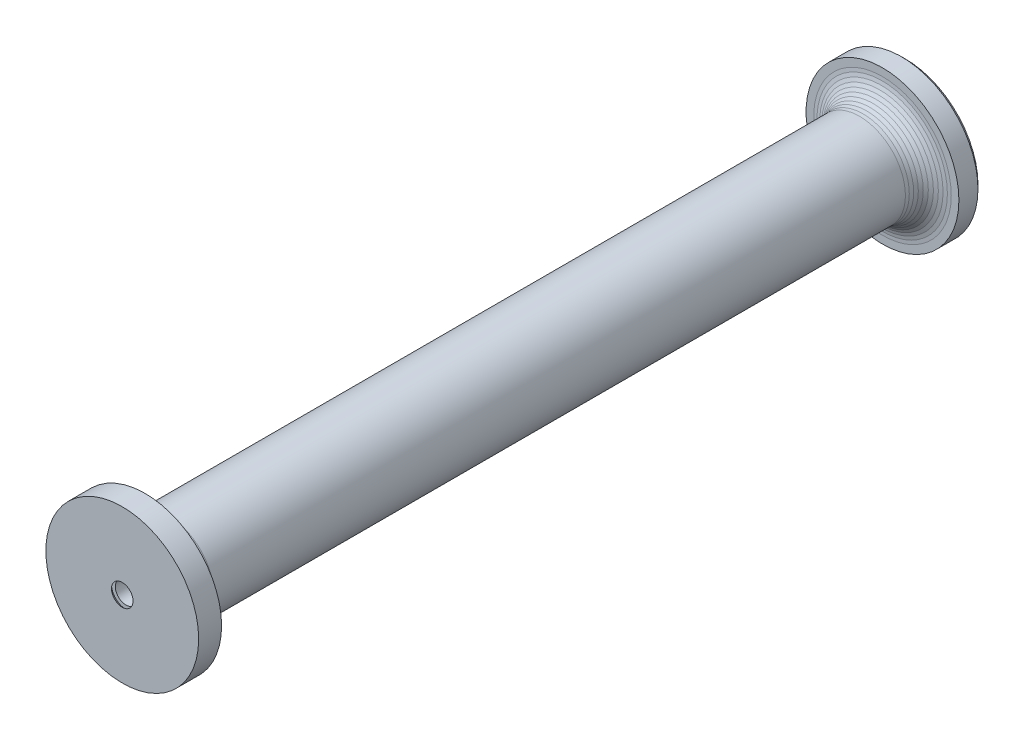
ISO-10303-21;
HEADER;
FILE_DESCRIPTION(('STEP AP214'),'2;1');
FILE_NAME('part.step','',(''),(''),'','','');
FILE_SCHEMA(('AUTOMOTIVE_DESIGN { 1 0 10303 214 1 1 1 1 }'));
ENDSEC;
DATA;
#1=APPLICATION_CONTEXT('core data for automotive mechanical design processes');
#2=APPLICATION_PROTOCOL_DEFINITION('international standard','automotive_design',2000,#1);
#3=PRODUCT_CONTEXT('',#1,'mechanical');
#4=PRODUCT('Part','Part','',(#3));
#5=PRODUCT_RELATED_PRODUCT_CATEGORY('part','',(#4));
#6=PRODUCT_DEFINITION_FORMATION('','',#4);
#7=PRODUCT_DEFINITION_CONTEXT('part definition',#1,'design');
#8=PRODUCT_DEFINITION('design','',#6,#7);
#9=PRODUCT_DEFINITION_SHAPE('','',#8);
#10=(LENGTH_UNIT() NAMED_UNIT(*) SI_UNIT(.MILLI.,.METRE.));
#11=(NAMED_UNIT(*) PLANE_ANGLE_UNIT() SI_UNIT($,.RADIAN.));
#12=(NAMED_UNIT(*) SI_UNIT($,.STERADIAN.) SOLID_ANGLE_UNIT());
#13=UNCERTAINTY_MEASURE_WITH_UNIT(LENGTH_MEASURE(1.E-05),#10,'distance_accuracy_value','');
#14=(GEOMETRIC_REPRESENTATION_CONTEXT(3) GLOBAL_UNCERTAINTY_ASSIGNED_CONTEXT((#13)) GLOBAL_UNIT_ASSIGNED_CONTEXT((#10,
#11,#12)) REPRESENTATION_CONTEXT('',''));
#15=CARTESIAN_POINT('',(0.,0.,0.));
#16=DIRECTION('',(0.,0.,1.));
#17=DIRECTION('',(1.,0.,0.));
#18=AXIS2_PLACEMENT_3D('',#15,#16,#17);
#19=CARTESIAN_POINT('',(0.,0.,12.01));
#20=DIRECTION('',(0.,0.,1.));
#21=DIRECTION('',(1.,0.,0.));
#22=AXIS2_PLACEMENT_3D('',#19,#20,#21);
#23=PLANE('',#22);
#24=CARTESIAN_POINT('',(0.,0.,12.01));
#25=DIRECTION('',(0.,0.,1.));
#26=DIRECTION('',(1.,0.,0.));
#27=AXIS2_PLACEMENT_3D('',#24,#25,#26);
#28=CIRCLE('',#27,1.4);
#29=CARTESIAN_POINT('',(1.4,0.,12.01));
#30=VERTEX_POINT('',#29);
#31=EDGE_CURVE('E9',#30,#30,#28,.T.);
#32=ORIENTED_EDGE('',*,*,#31,.F.);
#33=EDGE_LOOP('',(#32));
#34=FACE_BOUND('',#33,.T.);
#35=ADVANCED_FACE('F14',(#34),#23,.F.);
#36=CARTESIAN_POINT('',(0.,0.,-0.01));
#37=DIRECTION('',(0.,0.,1.));
#38=DIRECTION('',(1.,0.,0.));
#39=AXIS2_PLACEMENT_3D('',#36,#37,#38);
#40=CYLINDRICAL_SURFACE('',#39,1.4);
#41=CARTESIAN_POINT('',(0.,0.,0.49));
#42=DIRECTION('',(0.,0.,1.));
#43=DIRECTION('',(1.,0.,0.));
#44=AXIS2_PLACEMENT_3D('',#41,#42,#43);
#45=CIRCLE('',#44,1.4);
#46=CARTESIAN_POINT('',(1.4,0.,0.49));
#47=VERTEX_POINT('',#46);
#48=EDGE_CURVE('E262',#47,#47,#45,.T.);
#49=ORIENTED_EDGE('',*,*,#48,.F.);
#50=DIRECTION('',(0.,0.,1.));
#51=VECTOR('',#50,1.);
#52=CARTESIAN_POINT('',(1.4,0.,-0.01));
#53=LINE('',#52,#51);
#54=EDGE_CURVE('E25',#47,#30,#53,.T.);
#55=ORIENTED_EDGE('',*,*,#54,.T.);
#56=ORIENTED_EDGE('',*,*,#31,.T.);
#57=ORIENTED_EDGE('',*,*,#54,.F.);
#58=EDGE_LOOP('',(#49,#55,#56,#57));
#59=FACE_BOUND('',#58,.T.);
#60=ADVANCED_FACE('F397',(#59),#40,.F.);
#61=CARTESIAN_POINT('',(0.,0.,90.49));
#62=DIRECTION('',(0.,0.,1.));
#63=DIRECTION('',(1.,0.,0.));
#64=AXIS2_PLACEMENT_3D('',#61,#62,#63);
#65=PLANE('',#64);
#66=CARTESIAN_POINT('',(0.,0.,90.49));
#67=DIRECTION('',(0.,0.,1.));
#68=DIRECTION('',(1.,0.,0.));
#69=AXIS2_PLACEMENT_3D('',#66,#67,#68);
#70=CIRCLE('',#69,1.4);
#71=CARTESIAN_POINT('',(1.4,0.,90.49));
#72=VERTEX_POINT('',#71);
#73=EDGE_CURVE('E259',#72,#72,#70,.T.);
#74=ORIENTED_EDGE('',*,*,#73,.T.);
#75=EDGE_LOOP('',(#74));
#76=FACE_BOUND('',#75,.T.);
#77=ADVANCED_FACE('F403',(#76),#65,.T.);
#78=CARTESIAN_POINT('',(0.,0.,0.49));
#79=DIRECTION('',(0.,0.,1.));
#80=DIRECTION('',(1.,0.,0.));
#81=AXIS2_PLACEMENT_3D('',#78,#79,#80);
#82=PLANE('',#81);
#83=ORIENTED_EDGE('',*,*,#48,.T.);
#84=EDGE_LOOP('',(#83));
#85=FACE_BOUND('',#84,.T.);
#86=CARTESIAN_POINT('',(0.,0.,0.49));
#87=DIRECTION('',(0.,0.,1.));
#88=DIRECTION('',(1.,0.,0.));
#89=AXIS2_PLACEMENT_3D('',#86,#87,#88);
#90=CIRCLE('',#89,1.9);
#91=CARTESIAN_POINT('',(1.9,0.,0.49));
#92=VERTEX_POINT('',#91);
#93=EDGE_CURVE('E275',#92,#92,#90,.T.);
#94=ORIENTED_EDGE('',*,*,#93,.F.);
#95=EDGE_LOOP('',(#94));
#96=FACE_BOUND('',#95,.T.);
#97=ADVANCED_FACE('F411',(#85,#96),#82,.F.);
#98=CARTESIAN_POINT('',(0.,0.,90.49));
#99=DIRECTION('',(0.,0.,1.));
#100=DIRECTION('',(1.,0.,0.));
#101=AXIS2_PLACEMENT_3D('',#98,#99,#100);
#102=CYLINDRICAL_SURFACE('',#101,1.4);
#103=DIRECTION('',(0.,0.,1.));
#104=VECTOR('',#103,1.);
#105=CARTESIAN_POINT('',(1.4,0.,90.49));
#106=LINE('',#105,#104);
#107=CARTESIAN_POINT('',(1.4,0.,102.01));
#108=VERTEX_POINT('',#107);
#109=EDGE_CURVE('E263',#72,#108,#106,.T.);
#110=ORIENTED_EDGE('',*,*,#109,.F.);
#111=ORIENTED_EDGE('',*,*,#73,.F.);
#112=ORIENTED_EDGE('',*,*,#109,.T.);
#113=CARTESIAN_POINT('',(0.,0.,102.01));
#114=DIRECTION('',(0.,0.,1.));
#115=DIRECTION('',(1.,0.,0.));
#116=AXIS2_PLACEMENT_3D('',#113,#114,#115);
#117=CIRCLE('',#116,1.4);
#118=EDGE_CURVE('E772',#108,#108,#117,.T.);
#119=ORIENTED_EDGE('',*,*,#118,.T.);
#120=EDGE_LOOP('',(#110,#111,#112,#119));
#121=FACE_BOUND('',#120,.T.);
#122=ADVANCED_FACE('F390',(#121),#102,.F.);
#123=CARTESIAN_POINT('',(0.,0.,-0.01));
#124=DIRECTION('',(0.,0.,1.));
#125=DIRECTION('',(1.,0.,0.));
#126=AXIS2_PLACEMENT_3D('',#123,#124,#125);
#127=CONICAL_SURFACE('',#126,1.4,0.785398163397);
#128=CARTESIAN_POINT('',(0.,0.,0.));
#129=DIRECTION('',(0.,0.,1.));
#130=DIRECTION('',(1.,0.,0.));
#131=AXIS2_PLACEMENT_3D('',#128,#129,#130);
#132=CIRCLE('',#131,1.41);
#133=CARTESIAN_POINT('',(1.41,0.,0.));
#134=VERTEX_POINT('',#133);
#135=EDGE_CURVE('E251',#134,#134,#132,.T.);
#136=ORIENTED_EDGE('',*,*,#135,.F.);
#137=DIRECTION('',(0.707106781186548,0.,0.707106781186548));
#138=VECTOR('',#137,1.);
#139=CARTESIAN_POINT('',(1.4,0.,-0.01));
#140=LINE('',#139,#138);
#141=EDGE_CURVE('E353',#134,#92,#140,.T.);
#142=ORIENTED_EDGE('',*,*,#141,.T.);
#143=ORIENTED_EDGE('',*,*,#93,.T.);
#144=ORIENTED_EDGE('',*,*,#141,.F.);
#145=EDGE_LOOP('',(#136,#142,#143,#144));
#146=FACE_BOUND('',#145,.T.);
#147=ADVANCED_FACE('F380',(#146),#127,.F.);
#148=CARTESIAN_POINT('',(0.,0.,102.01));
#149=DIRECTION('',(0.,0.,1.));
#150=DIRECTION('',(1.,0.,0.));
#151=AXIS2_PLACEMENT_3D('',#148,#149,#150);
#152=PLANE('',#151);
#153=ORIENTED_EDGE('',*,*,#118,.F.);
#154=EDGE_LOOP('',(#153));
#155=FACE_BOUND('',#154,.T.);
#156=CARTESIAN_POINT('',(0.,0.,102.01));
#157=DIRECTION('',(0.,0.,1.));
#158=DIRECTION('',(1.,0.,0.));
#159=AXIS2_PLACEMENT_3D('',#156,#157,#158);
#160=CIRCLE('',#159,1.9);
#161=CARTESIAN_POINT('',(1.9,0.,102.01));
#162=VERTEX_POINT('',#161);
#163=EDGE_CURVE('E249',#162,#162,#160,.T.);
#164=ORIENTED_EDGE('',*,*,#163,.T.);
#165=EDGE_LOOP('',(#164));
#166=FACE_BOUND('',#165,.T.);
#167=ADVANCED_FACE('F377',(#155,#166),#152,.T.);
#168=CARTESIAN_POINT('',(0.,0.,0.));
#169=DIRECTION('',(0.,0.,1.));
#170=DIRECTION('',(1.,0.,0.));
#171=AXIS2_PLACEMENT_3D('',#168,#169,#170);
#172=PLANE('',#171);
#173=ORIENTED_EDGE('',*,*,#135,.T.);
#174=EDGE_LOOP('',(#173));
#175=FACE_BOUND('',#174,.T.);
#176=CARTESIAN_POINT('',(0.,0.,0.));
#177=DIRECTION('',(0.,0.,1.));
#178=DIRECTION('',(1.,0.,0.));
#179=AXIS2_PLACEMENT_3D('',#176,#177,#178);
#180=CIRCLE('',#179,9.5);
#181=CARTESIAN_POINT('',(9.5,0.,0.));
#182=VERTEX_POINT('',#181);
#183=EDGE_CURVE('E349',#182,#182,#180,.T.);
#184=ORIENTED_EDGE('',*,*,#183,.F.);
#185=EDGE_LOOP('',(#184));
#186=FACE_BOUND('',#185,.T.);
#187=ADVANCED_FACE('F379',(#175,#186),#172,.F.);
#188=CARTESIAN_POINT('',(0.,0.,102.01));
#189=DIRECTION('',(0.,0.,-1.));
#190=DIRECTION('',(1.,0.,0.));
#191=AXIS2_PLACEMENT_3D('',#188,#189,#190);
#192=CONICAL_SURFACE('',#191,1.9,0.785398163397);
#193=DIRECTION('',(-0.707106781186548,0.,0.707106781186548));
#194=VECTOR('',#193,1.);
#195=CARTESIAN_POINT('',(1.9,0.,102.01));
#196=LINE('',#195,#194);
#197=CARTESIAN_POINT('',(1.41,0.,102.5));
#198=VERTEX_POINT('',#197);
#199=EDGE_CURVE('E252',#162,#198,#196,.T.);
#200=ORIENTED_EDGE('',*,*,#199,.F.);
#201=ORIENTED_EDGE('',*,*,#163,.F.);
#202=ORIENTED_EDGE('',*,*,#199,.T.);
#203=CARTESIAN_POINT('',(0.,0.,102.5));
#204=DIRECTION('',(0.,0.,1.));
#205=DIRECTION('',(1.,0.,0.));
#206=AXIS2_PLACEMENT_3D('',#203,#204,#205);
#207=CIRCLE('',#206,1.41);
#208=EDGE_CURVE('E311',#198,#198,#207,.T.);
#209=ORIENTED_EDGE('',*,*,#208,.T.);
#210=EDGE_LOOP('',(#200,#201,#202,#209));
#211=FACE_BOUND('',#210,.T.);
#212=ADVANCED_FACE('F374',(#211),#192,.F.);
#213=CARTESIAN_POINT('',(0.,0.,0.));
#214=DIRECTION('',(0.,0.,1.));
#215=DIRECTION('',(1.,0.,0.));
#216=AXIS2_PLACEMENT_3D('',#213,#214,#215);
#217=CONICAL_SURFACE('',#216,9.5,0.775497496809);
#218=CARTESIAN_POINT('',(0.,0.,0.505));
#219=DIRECTION('',(0.,0.,1.));
#220=DIRECTION('',(1.,0.,0.));
#221=AXIS2_PLACEMENT_3D('',#218,#219,#220);
#222=CIRCLE('',#221,9.995098039216);
#223=CARTESIAN_POINT('',(9.995098039216,0.,0.505));
#224=VERTEX_POINT('',#223);
#225=EDGE_CURVE('E307',#224,#224,#222,.T.);
#226=ORIENTED_EDGE('',*,*,#225,.F.);
#227=DIRECTION('',(0.700071410925818,0.,0.714072839144814));
#228=VECTOR('',#227,1.);
#229=CARTESIAN_POINT('',(9.5,0.,0.));
#230=LINE('',#229,#228);
#231=EDGE_CURVE('E330',#182,#224,#230,.T.);
#232=ORIENTED_EDGE('',*,*,#231,.F.);
#233=ORIENTED_EDGE('',*,*,#183,.T.);
#234=ORIENTED_EDGE('',*,*,#231,.T.);
#235=EDGE_LOOP('',(#226,#232,#233,#234));
#236=FACE_BOUND('',#235,.T.);
#237=ADVANCED_FACE('F417',(#236),#217,.T.);
#238=CARTESIAN_POINT('',(0.,0.,102.5));
#239=DIRECTION('',(0.,0.,1.));
#240=DIRECTION('',(1.,0.,0.));
#241=AXIS2_PLACEMENT_3D('',#238,#239,#240);
#242=PLANE('',#241);
#243=ORIENTED_EDGE('',*,*,#208,.F.);
#244=EDGE_LOOP('',(#243));
#245=FACE_BOUND('',#244,.T.);
#246=CARTESIAN_POINT('',(0.,0.,102.5));
#247=DIRECTION('',(0.,0.,1.));
#248=DIRECTION('',(1.,0.,0.));
#249=AXIS2_PLACEMENT_3D('',#246,#247,#248);
#250=CIRCLE('',#249,10.);
#251=CARTESIAN_POINT('',(10.,0.,102.5));
#252=VERTEX_POINT('',#251);
#253=EDGE_CURVE('E334',#252,#252,#250,.T.);
#254=ORIENTED_EDGE('',*,*,#253,.T.);
#255=EDGE_LOOP('',(#254));
#256=FACE_BOUND('',#255,.T.);
#257=ADVANCED_FACE('F420',(#245,#256),#242,.T.);
#258=CARTESIAN_POINT('',(0.,0.,0.505));
#259=DIRECTION('',(0.,0.,1.));
#260=DIRECTION('',(1.,0.,0.));
#261=AXIS2_PLACEMENT_3D('',#258,#259,#260);
#262=PLANE('',#261);
#263=ORIENTED_EDGE('',*,*,#225,.T.);
#264=EDGE_LOOP('',(#263));
#265=FACE_BOUND('',#264,.T.);
#266=CARTESIAN_POINT('',(0.,0.,0.505));
#267=DIRECTION('',(0.,0.,1.));
#268=DIRECTION('',(1.,0.,0.));
#269=AXIS2_PLACEMENT_3D('',#266,#267,#268);
#270=CIRCLE('',#269,10.);
#271=CARTESIAN_POINT('',(10.,0.,0.505));
#272=VERTEX_POINT('',#271);
#273=EDGE_CURVE('E303',#272,#272,#270,.T.);
#274=ORIENTED_EDGE('',*,*,#273,.F.);
#275=EDGE_LOOP('',(#274));
#276=FACE_BOUND('',#275,.T.);
#277=ADVANCED_FACE('F467',(#265,#276),#262,.F.);
#278=CARTESIAN_POINT('',(0.,0.,99.5));
#279=DIRECTION('',(0.,0.,1.));
#280=DIRECTION('',(1.,0.,0.));
#281=AXIS2_PLACEMENT_3D('',#278,#279,#280);
#282=CYLINDRICAL_SURFACE('',#281,10.);
#283=ORIENTED_EDGE('',*,*,#253,.F.);
#284=DIRECTION('',(0.,0.,1.));
#285=VECTOR('',#284,1.);
#286=CARTESIAN_POINT('',(10.,0.,99.5));
#287=LINE('',#286,#285);
#288=CARTESIAN_POINT('',(10.,0.,99.5));
#289=VERTEX_POINT('',#288);
#290=EDGE_CURVE('E312',#289,#252,#287,.T.);
#291=ORIENTED_EDGE('',*,*,#290,.F.);
#292=CARTESIAN_POINT('',(0.,0.,99.5));
#293=DIRECTION('',(0.,0.,1.));
#294=DIRECTION('',(1.,0.,0.));
#295=AXIS2_PLACEMENT_3D('',#292,#293,#294);
#296=CIRCLE('',#295,10.);
#297=EDGE_CURVE('E273',#289,#289,#296,.T.);
#298=ORIENTED_EDGE('',*,*,#297,.T.);
#299=ORIENTED_EDGE('',*,*,#290,.T.);
#300=EDGE_LOOP('',(#283,#291,#298,#299));
#301=FACE_BOUND('',#300,.T.);
#302=ADVANCED_FACE('F463',(#301),#282,.T.);
#303=CARTESIAN_POINT('',(0.,0.,0.));
#304=DIRECTION('',(0.,0.,1.));
#305=DIRECTION('',(1.,0.,0.));
#306=AXIS2_PLACEMENT_3D('',#303,#304,#305);
#307=CYLINDRICAL_SURFACE('',#306,10.);
#308=DIRECTION('',(0.,0.,1.));
#309=VECTOR('',#308,1.);
#310=CARTESIAN_POINT('',(10.,0.,0.));
#311=LINE('',#310,#309);
#312=CARTESIAN_POINT('',(10.,0.,3.));
#313=VERTEX_POINT('',#312);
#314=EDGE_CURVE('E300',#272,#313,#311,.T.);
#315=ORIENTED_EDGE('',*,*,#314,.T.);
#316=CARTESIAN_POINT('',(0.,0.,3.));
#317=DIRECTION('',(0.,0.,1.));
#318=DIRECTION('',(1.,0.,0.));
#319=AXIS2_PLACEMENT_3D('',#316,#317,#318);
#320=CIRCLE('',#319,10.);
#321=EDGE_CURVE('E269',#313,#313,#320,.T.);
#322=ORIENTED_EDGE('',*,*,#321,.F.);
#323=ORIENTED_EDGE('',*,*,#314,.F.);
#324=ORIENTED_EDGE('',*,*,#273,.T.);
#325=EDGE_LOOP('',(#315,#322,#323,#324));
#326=FACE_BOUND('',#325,.T.);
#327=ADVANCED_FACE('F466',(#326),#307,.T.);
#328=CARTESIAN_POINT('',(0.,0.,99.5));
#329=DIRECTION('',(0.,0.,1.));
#330=DIRECTION('',(1.,0.,0.));
#331=AXIS2_PLACEMENT_3D('',#328,#329,#330);
#332=PLANE('',#331);
#333=CARTESIAN_POINT('',(0.,0.,99.5));
#334=DIRECTION('',(0.,0.,-1.));
#335=DIRECTION('',(1.,0.,0.));
#336=AXIS2_PLACEMENT_3D('',#333,#334,#335);
#337=CIRCLE('',#336,9.);
#338=CARTESIAN_POINT('',(9.,0.,99.5));
#339=VERTEX_POINT('',#338);
#340=EDGE_CURVE('E306',#339,#339,#337,.T.);
#341=ORIENTED_EDGE('',*,*,#340,.F.);
#342=EDGE_LOOP('',(#341));
#343=FACE_BOUND('',#342,.T.);
#344=ORIENTED_EDGE('',*,*,#297,.F.);
#345=EDGE_LOOP('',(#344));
#346=FACE_BOUND('',#345,.T.);
#347=ADVANCED_FACE('F471',(#343,#346),#332,.F.);
#348=CARTESIAN_POINT('',(0.,0.,3.));
#349=DIRECTION('',(0.,0.,1.));
#350=DIRECTION('',(1.,0.,0.));
#351=AXIS2_PLACEMENT_3D('',#348,#349,#350);
#352=PLANE('',#351);
#353=CARTESIAN_POINT('',(0.,0.,3.));
#354=DIRECTION('',(0.,0.,1.));
#355=DIRECTION('',(1.,0.,0.));
#356=AXIS2_PLACEMENT_3D('',#353,#354,#355);
#357=CIRCLE('',#356,9.);
#358=CARTESIAN_POINT('',(9.,0.,3.));
#359=VERTEX_POINT('',#358);
#360=EDGE_CURVE('E284',#359,#359,#357,.T.);
#361=ORIENTED_EDGE('',*,*,#360,.F.);
#362=EDGE_LOOP('',(#361));
#363=FACE_BOUND('',#362,.T.);
#364=ORIENTED_EDGE('',*,*,#321,.T.);
#365=EDGE_LOOP('',(#364));
#366=FACE_BOUND('',#365,.T.);
#367=ADVANCED_FACE('F483',(#363,#366),#352,.T.);
#368=CARTESIAN_POINT('',(0.,0.,99.5));
#369=DIRECTION('',(0.,0.,1.));
#370=DIRECTION('',(1.,0.,0.));
#371=AXIS2_PLACEMENT_3D('',#368,#369,#370);
#372=CONICAL_SURFACE('',#371,9.,1.492256510455);
#373=ORIENTED_EDGE('',*,*,#340,.T.);
#374=DIRECTION('',(-0.996917333733127,0.,-0.07845909572786));
#375=VECTOR('',#374,1.);
#376=CARTESIAN_POINT('',(9.,0.,99.5));
#377=LINE('',#376,#375);
#378=CARTESIAN_POINT('',(8.530696604879,0.,99.463065021785));
#379=VERTEX_POINT('',#378);
#380=EDGE_CURVE('E163',#339,#379,#377,.T.);
#381=ORIENTED_EDGE('',*,*,#380,.T.);
#382=CARTESIAN_POINT('',(0.,0.,99.463065021785));
#383=DIRECTION('',(0.,0.,-1.));
#384=DIRECTION('',(1.,0.,0.));
#385=AXIS2_PLACEMENT_3D('',#382,#383,#384);
#386=CIRCLE('',#385,8.530696604879);
#387=EDGE_CURVE('E257',#379,#379,#386,.T.);
#388=ORIENTED_EDGE('',*,*,#387,.F.);
#389=ORIENTED_EDGE('',*,*,#380,.F.);
#390=EDGE_LOOP('',(#373,#381,#388,#389));
#391=FACE_BOUND('',#390,.T.);
#392=ADVANCED_FACE('F449',(#391),#372,.T.);
#393=CARTESIAN_POINT('',(0.,0.,3.));
#394=DIRECTION('',(0.,0.,-1.));
#395=DIRECTION('',(1.,0.,0.));
#396=AXIS2_PLACEMENT_3D('',#393,#394,#395);
#397=CONICAL_SURFACE('',#396,9.,1.492256510455);
#398=ORIENTED_EDGE('',*,*,#360,.T.);
#399=DIRECTION('',(-0.996917333733127,0.,0.07845909572786));
#400=VECTOR('',#399,1.);
#401=CARTESIAN_POINT('',(9.,0.,3.));
#402=LINE('',#401,#400);
#403=CARTESIAN_POINT('',(8.530696604879,0.,3.036934978215));
#404=VERTEX_POINT('',#403);
#405=EDGE_CURVE('E173',#359,#404,#402,.T.);
#406=ORIENTED_EDGE('',*,*,#405,.T.);
#407=CARTESIAN_POINT('',(0.,0.,3.036934978215));
#408=DIRECTION('',(0.,0.,1.));
#409=DIRECTION('',(1.,0.,0.));
#410=AXIS2_PLACEMENT_3D('',#407,#408,#409);
#411=CIRCLE('',#410,8.530696604879);
#412=EDGE_CURVE('E258',#404,#404,#411,.T.);
#413=ORIENTED_EDGE('',*,*,#412,.F.);
#414=ORIENTED_EDGE('',*,*,#405,.F.);
#415=EDGE_LOOP('',(#398,#406,#413,#414));
#416=FACE_BOUND('',#415,.T.);
#417=ADVANCED_FACE('F446',(#416),#397,.T.);
#418=CARTESIAN_POINT('',(0.,0.,99.463065021785));
#419=DIRECTION('',(0.,0.,1.));
#420=DIRECTION('',(1.,0.,0.));
#421=AXIS2_PLACEMENT_3D('',#418,#419,#420);
#422=CONICAL_SURFACE('',#421,8.530696604879,1.335176877776);
#423=ORIENTED_EDGE('',*,*,#387,.T.);
#424=DIRECTION('',(-0.972369920397673,0.,-0.233445363855921));
#425=VECTOR('',#424,1.);
#426=CARTESIAN_POINT('',(8.530696604879,0.,99.463065021785));
#427=LINE('',#426,#425);
#428=CARTESIAN_POINT('',(8.072949016875,0.,99.353169548885));
#429=VERTEX_POINT('',#428);
#430=EDGE_CURVE('E278',#379,#429,#427,.T.);
#431=ORIENTED_EDGE('',*,*,#430,.T.);
#432=CARTESIAN_POINT('',(0.,0.,99.353169548885));
#433=DIRECTION('',(0.,0.,-1.));
#434=DIRECTION('',(1.,0.,0.));
#435=AXIS2_PLACEMENT_3D('',#432,#433,#434);
#436=CIRCLE('',#435,8.072949016875);
#437=EDGE_CURVE('E237',#429,#429,#436,.T.);
#438=ORIENTED_EDGE('',*,*,#437,.F.);
#439=ORIENTED_EDGE('',*,*,#430,.F.);
#440=EDGE_LOOP('',(#423,#431,#438,#439));
#441=FACE_BOUND('',#440,.T.);
#442=ADVANCED_FACE('F407',(#441),#422,.T.);
#443=CARTESIAN_POINT('',(0.,0.,3.036934978215));
#444=DIRECTION('',(0.,0.,-1.));
#445=DIRECTION('',(1.,0.,0.));
#446=AXIS2_PLACEMENT_3D('',#443,#444,#445);
#447=CONICAL_SURFACE('',#446,8.530696604879,1.335176877776);
#448=ORIENTED_EDGE('',*,*,#412,.T.);
#449=DIRECTION('',(-0.972369920397673,0.,0.233445363855921));
#450=VECTOR('',#449,1.);
#451=CARTESIAN_POINT('',(8.530696604879,0.,3.036934978215));
#452=LINE('',#451,#450);
#453=CARTESIAN_POINT('',(8.072949016875,0.,3.146830451115));
#454=VERTEX_POINT('',#453);
#455=EDGE_CURVE('E254',#404,#454,#452,.T.);
#456=ORIENTED_EDGE('',*,*,#455,.T.);
#457=CARTESIAN_POINT('',(0.,0.,3.146830451115));
#458=DIRECTION('',(0.,0.,1.));
#459=DIRECTION('',(1.,0.,0.));
#460=AXIS2_PLACEMENT_3D('',#457,#458,#459);
#461=CIRCLE('',#460,8.072949016875);
#462=EDGE_CURVE('E333',#454,#454,#461,.T.);
#463=ORIENTED_EDGE('',*,*,#462,.F.);
#464=ORIENTED_EDGE('',*,*,#455,.F.);
#465=EDGE_LOOP('',(#448,#456,#463,#464));
#466=FACE_BOUND('',#465,.T.);
#467=ADVANCED_FACE('F488',(#466),#447,.T.);
#468=CARTESIAN_POINT('',(0.,0.,99.353169548885));
#469=DIRECTION('',(0.,0.,1.));
#470=DIRECTION('',(1.,0.,0.));
#471=AXIS2_PLACEMENT_3D('',#468,#469,#470);
#472=CONICAL_SURFACE('',#471,8.072949016875,1.178097245096);
#473=ORIENTED_EDGE('',*,*,#437,.T.);
#474=DIRECTION('',(-0.923879532511277,0.,-0.382683432365114));
#475=VECTOR('',#474,1.);
#476=CARTESIAN_POINT('',(8.072949016875,0.,99.353169548885));
#477=LINE('',#476,#475);
#478=CARTESIAN_POINT('',(7.638028500781,0.,99.173019572565));
#479=VERTEX_POINT('',#478);
#480=EDGE_CURVE('E241',#429,#479,#477,.T.);
#481=ORIENTED_EDGE('',*,*,#480,.T.);
#482=CARTESIAN_POINT('',(0.,0.,99.173019572565));
#483=DIRECTION('',(0.,0.,-1.));
#484=DIRECTION('',(1.,0.,0.));
#485=AXIS2_PLACEMENT_3D('',#482,#483,#484);
#486=CIRCLE('',#485,7.638028500781);
#487=EDGE_CURVE('E299',#479,#479,#486,.T.);
#488=ORIENTED_EDGE('',*,*,#487,.F.);
#489=ORIENTED_EDGE('',*,*,#480,.F.);
#490=EDGE_LOOP('',(#473,#481,#488,#489));
#491=FACE_BOUND('',#490,.T.);
#492=ADVANCED_FACE('F458',(#491),#472,.T.);
#493=CARTESIAN_POINT('',(0.,0.,3.146830451115));
#494=DIRECTION('',(0.,0.,-1.));
#495=DIRECTION('',(1.,0.,0.));
#496=AXIS2_PLACEMENT_3D('',#493,#494,#495);
#497=CONICAL_SURFACE('',#496,8.072949016875,1.178097245096);
#498=ORIENTED_EDGE('',*,*,#462,.T.);
#499=DIRECTION('',(-0.923879532511277,0.,0.382683432365114));
#500=VECTOR('',#499,1.);
#501=CARTESIAN_POINT('',(8.072949016875,0.,3.146830451115));
#502=LINE('',#501,#500);
#503=CARTESIAN_POINT('',(7.638028500781,0.,3.326980427435));
#504=VERTEX_POINT('',#503);
#505=EDGE_CURVE('E242',#454,#504,#502,.T.);
#506=ORIENTED_EDGE('',*,*,#505,.T.);
#507=CARTESIAN_POINT('',(0.,0.,3.326980427435));
#508=DIRECTION('',(0.,0.,1.));
#509=DIRECTION('',(1.,0.,0.));
#510=AXIS2_PLACEMENT_3D('',#507,#508,#509);
#511=CIRCLE('',#510,7.638028500781);
#512=EDGE_CURVE('E243',#504,#504,#511,.T.);
#513=ORIENTED_EDGE('',*,*,#512,.F.);
#514=ORIENTED_EDGE('',*,*,#505,.F.);
#515=EDGE_LOOP('',(#498,#506,#513,#514));
#516=FACE_BOUND('',#515,.T.);
#517=ADVANCED_FACE('F455',(#516),#497,.T.);
#518=CARTESIAN_POINT('',(0.,0.,99.173019572565));
#519=DIRECTION('',(0.,0.,1.));
#520=DIRECTION('',(1.,0.,0.));
#521=AXIS2_PLACEMENT_3D('',#518,#519,#520);
#522=CONICAL_SURFACE('',#521,7.638028500781,1.021017612417);
#523=ORIENTED_EDGE('',*,*,#487,.T.);
#524=DIRECTION('',(-0.852640164354044,0.,-0.522498564716027));
#525=VECTOR('',#524,1.);
#526=CARTESIAN_POINT('',(7.638028500781,0.,99.173019572565));
#527=LINE('',#526,#525);
#528=CARTESIAN_POINT('',(7.236644243123,0.,98.927050983125));
#529=VERTEX_POINT('',#528);
#530=EDGE_CURVE('E340',#479,#529,#527,.T.);
#531=ORIENTED_EDGE('',*,*,#530,.T.);
#532=CARTESIAN_POINT('',(0.,0.,98.927050983125));
#533=DIRECTION('',(0.,0.,-1.));
#534=DIRECTION('',(1.,0.,0.));
#535=AXIS2_PLACEMENT_3D('',#532,#533,#534);
#536=CIRCLE('',#535,7.236644243123);
#537=EDGE_CURVE('E356',#529,#529,#536,.T.);
#538=ORIENTED_EDGE('',*,*,#537,.F.);
#539=ORIENTED_EDGE('',*,*,#530,.F.);
#540=EDGE_LOOP('',(#523,#531,#538,#539));
#541=FACE_BOUND('',#540,.T.);
#542=ADVANCED_FACE('F16',(#541),#522,.T.);
#543=CARTESIAN_POINT('',(0.,0.,3.326980427435));
#544=DIRECTION('',(0.,0.,-1.));
#545=DIRECTION('',(1.,0.,0.));
#546=AXIS2_PLACEMENT_3D('',#543,#544,#545);
#547=CONICAL_SURFACE('',#546,7.638028500781,1.021017612417);
#548=ORIENTED_EDGE('',*,*,#512,.T.);
#549=DIRECTION('',(-0.852640164354044,0.,0.522498564716027));
#550=VECTOR('',#549,1.);
#551=CARTESIAN_POINT('',(7.638028500781,0.,3.326980427435));
#552=LINE('',#551,#550);
#553=CARTESIAN_POINT('',(7.236644243123,0.,3.572949016875));
#554=VERTEX_POINT('',#553);
#555=EDGE_CURVE('E247',#504,#554,#552,.T.);
#556=ORIENTED_EDGE('',*,*,#555,.T.);
#557=CARTESIAN_POINT('',(0.,0.,3.572949016875));
#558=DIRECTION('',(0.,0.,1.));
#559=DIRECTION('',(1.,0.,0.));
#560=AXIS2_PLACEMENT_3D('',#557,#558,#559);
#561=CIRCLE('',#560,7.236644243123);
#562=EDGE_CURVE('E323',#554,#554,#561,.T.);
#563=ORIENTED_EDGE('',*,*,#562,.F.);
#564=ORIENTED_EDGE('',*,*,#555,.F.);
#565=EDGE_LOOP('',(#548,#556,#563,#564));
#566=FACE_BOUND('',#565,.T.);
#567=ADVANCED_FACE('F426',(#566),#547,.T.);
#568=CARTESIAN_POINT('',(0.,0.,98.927050983125));
#569=DIRECTION('',(0.,0.,1.));
#570=DIRECTION('',(1.,0.,0.));
#571=AXIS2_PLACEMENT_3D('',#568,#569,#570);
#572=CONICAL_SURFACE('',#571,7.236644243123,0.863937979737);
#573=ORIENTED_EDGE('',*,*,#537,.T.);
#574=DIRECTION('',(-0.760405965600109,0.,-0.649448048330093));
#575=VECTOR('',#574,1.);
#576=CARTESIAN_POINT('',(7.236644243123,0.,98.927050983125));
#577=LINE('',#576,#575);
#578=CARTESIAN_POINT('',(6.87867965644,0.,98.62132034356));
#579=VERTEX_POINT('',#578);
#580=EDGE_CURVE('E248',#529,#579,#577,.T.);
#581=ORIENTED_EDGE('',*,*,#580,.T.);
#582=CARTESIAN_POINT('',(0.,0.,98.62132034356));
#583=DIRECTION('',(0.,0.,-1.));
#584=DIRECTION('',(1.,0.,0.));
#585=AXIS2_PLACEMENT_3D('',#582,#583,#584);
#586=CIRCLE('',#585,6.87867965644);
#587=EDGE_CURVE('E316',#579,#579,#586,.T.);
#588=ORIENTED_EDGE('',*,*,#587,.F.);
#589=ORIENTED_EDGE('',*,*,#580,.F.);
#590=EDGE_LOOP('',(#573,#581,#588,#589));
#591=FACE_BOUND('',#590,.T.);
#592=ADVANCED_FACE('F422',(#591),#572,.T.);
#593=CARTESIAN_POINT('',(0.,0.,3.572949016875));
#594=DIRECTION('',(0.,0.,-1.));
#595=DIRECTION('',(1.,0.,0.));
#596=AXIS2_PLACEMENT_3D('',#593,#594,#595);
#597=CONICAL_SURFACE('',#596,7.236644243123,0.863937979737);
#598=ORIENTED_EDGE('',*,*,#562,.T.);
#599=DIRECTION('',(-0.760405965600109,0.,0.649448048330093));
#600=VECTOR('',#599,1.);
#601=CARTESIAN_POINT('',(7.236644243123,0.,3.572949016875));
#602=LINE('',#601,#600);
#603=CARTESIAN_POINT('',(6.87867965644,0.,3.87867965644));
#604=VERTEX_POINT('',#603);
#605=EDGE_CURVE('E130',#554,#604,#602,.T.);
#606=ORIENTED_EDGE('',*,*,#605,.T.);
#607=CARTESIAN_POINT('',(0.,0.,3.87867965644));
#608=DIRECTION('',(0.,0.,1.));
#609=DIRECTION('',(1.,0.,0.));
#610=AXIS2_PLACEMENT_3D('',#607,#608,#609);
#611=CIRCLE('',#610,6.87867965644);
#612=EDGE_CURVE('E18',#604,#604,#611,.T.);
#613=ORIENTED_EDGE('',*,*,#612,.F.);
#614=ORIENTED_EDGE('',*,*,#605,.F.);
#615=EDGE_LOOP('',(#598,#606,#613,#614));
#616=FACE_BOUND('',#615,.T.);
#617=ADVANCED_FACE('F425',(#616),#597,.T.);
#618=CARTESIAN_POINT('',(0.,0.,98.62132034356));
#619=DIRECTION('',(0.,0.,1.));
#620=DIRECTION('',(1.,0.,0.));
#621=AXIS2_PLACEMENT_3D('',#618,#619,#620);
#622=CONICAL_SURFACE('',#621,6.87867965644,0.706858347058);
#623=ORIENTED_EDGE('',*,*,#587,.T.);
#624=DIRECTION('',(-0.649448048330093,0.,-0.760405965600109));
#625=VECTOR('',#624,1.);
#626=CARTESIAN_POINT('',(6.87867965644,0.,98.62132034356));
#627=LINE('',#626,#625);
#628=CARTESIAN_POINT('',(6.572949016875,0.,98.263355756877));
#629=VERTEX_POINT('',#628);
#630=EDGE_CURVE('E142',#579,#629,#627,.T.);
#631=ORIENTED_EDGE('',*,*,#630,.T.);
#632=CARTESIAN_POINT('',(0.,0.,98.263355756877));
#633=DIRECTION('',(0.,0.,-1.));
#634=DIRECTION('',(1.,0.,0.));
#635=AXIS2_PLACEMENT_3D('',#632,#633,#634);
#636=CIRCLE('',#635,6.572949016875);
#637=EDGE_CURVE('E236',#629,#629,#636,.T.);
#638=ORIENTED_EDGE('',*,*,#637,.F.);
#639=ORIENTED_EDGE('',*,*,#630,.F.);
#640=EDGE_LOOP('',(#623,#631,#638,#639));
#641=FACE_BOUND('',#640,.T.);
#642=ADVANCED_FACE('F432',(#641),#622,.T.);
#643=CARTESIAN_POINT('',(0.,0.,3.87867965644));
#644=DIRECTION('',(0.,0.,-1.));
#645=DIRECTION('',(1.,0.,0.));
#646=AXIS2_PLACEMENT_3D('',#643,#644,#645);
#647=CONICAL_SURFACE('',#646,6.87867965644,0.706858347058);
#648=ORIENTED_EDGE('',*,*,#612,.T.);
#649=DIRECTION('',(-0.649448048330093,0.,0.760405965600109));
#650=VECTOR('',#649,1.);
#651=CARTESIAN_POINT('',(6.87867965644,0.,3.87867965644));
#652=LINE('',#651,#650);
#653=CARTESIAN_POINT('',(6.572949016875,0.,4.236644243123));
#654=VERTEX_POINT('',#653);
#655=EDGE_CURVE('E313',#604,#654,#652,.T.);
#656=ORIENTED_EDGE('',*,*,#655,.T.);
#657=CARTESIAN_POINT('',(0.,0.,4.236644243123));
#658=DIRECTION('',(0.,0.,1.));
#659=DIRECTION('',(1.,0.,0.));
#660=AXIS2_PLACEMENT_3D('',#657,#658,#659);
#661=CIRCLE('',#660,6.572949016875);
#662=EDGE_CURVE('E320',#654,#654,#661,.T.);
#663=ORIENTED_EDGE('',*,*,#662,.F.);
#664=ORIENTED_EDGE('',*,*,#655,.F.);
#665=EDGE_LOOP('',(#648,#656,#663,#664));
#666=FACE_BOUND('',#665,.T.);
#667=ADVANCED_FACE('F475',(#666),#647,.T.);
#668=CARTESIAN_POINT('',(0.,0.,98.263355756877));
#669=DIRECTION('',(0.,0.,1.));
#670=DIRECTION('',(1.,0.,0.));
#671=AXIS2_PLACEMENT_3D('',#668,#669,#670);
#672=CONICAL_SURFACE('',#671,6.572949016875,0.549778714378);
#673=ORIENTED_EDGE('',*,*,#637,.T.);
#674=DIRECTION('',(-0.522498564716027,0.,-0.852640164354044));
#675=VECTOR('',#674,1.);
#676=CARTESIAN_POINT('',(6.572949016875,0.,98.263355756877));
#677=LINE('',#676,#675);
#678=CARTESIAN_POINT('',(6.326980427435,0.,97.861971499219));
#679=VERTEX_POINT('',#678);
#680=EDGE_CURVE('E233',#629,#679,#677,.T.);
#681=ORIENTED_EDGE('',*,*,#680,.T.);
#682=CARTESIAN_POINT('',(0.,0.,97.861971499219));
#683=DIRECTION('',(0.,0.,-1.));
#684=DIRECTION('',(1.,0.,0.));
#685=AXIS2_PLACEMENT_3D('',#682,#683,#684);
#686=CIRCLE('',#685,6.326980427435);
#687=EDGE_CURVE('E264',#679,#679,#686,.T.);
#688=ORIENTED_EDGE('',*,*,#687,.F.);
#689=ORIENTED_EDGE('',*,*,#680,.F.);
#690=EDGE_LOOP('',(#673,#681,#688,#689));
#691=FACE_BOUND('',#690,.T.);
#692=ADVANCED_FACE('F585',(#691),#672,.T.);
#693=CARTESIAN_POINT('',(0.,0.,4.236644243123));
#694=DIRECTION('',(0.,0.,-1.));
#695=DIRECTION('',(1.,0.,0.));
#696=AXIS2_PLACEMENT_3D('',#693,#694,#695);
#697=CONICAL_SURFACE('',#696,6.572949016875,0.549778714378);
#698=ORIENTED_EDGE('',*,*,#662,.T.);
#699=DIRECTION('',(-0.522498564716027,0.,0.852640164354044));
#700=VECTOR('',#699,1.);
#701=CARTESIAN_POINT('',(6.572949016875,0.,4.236644243123));
#702=LINE('',#701,#700);
#703=CARTESIAN_POINT('',(6.326980427435,0.,4.638028500781));
#704=VERTEX_POINT('',#703);
#705=EDGE_CURVE('E317',#654,#704,#702,.T.);
#706=ORIENTED_EDGE('',*,*,#705,.T.);
#707=CARTESIAN_POINT('',(0.,0.,4.638028500781));
#708=DIRECTION('',(0.,0.,1.));
#709=DIRECTION('',(1.,0.,0.));
#710=AXIS2_PLACEMENT_3D('',#707,#708,#709);
#711=CIRCLE('',#710,6.326980427435);
#712=EDGE_CURVE('E207',#704,#704,#711,.T.);
#713=ORIENTED_EDGE('',*,*,#712,.F.);
#714=ORIENTED_EDGE('',*,*,#705,.F.);
#715=EDGE_LOOP('',(#698,#706,#713,#714));
#716=FACE_BOUND('',#715,.T.);
#717=ADVANCED_FACE('F453',(#716),#697,.T.);
#718=CARTESIAN_POINT('',(0.,0.,97.861971499219));
#719=DIRECTION('',(0.,0.,1.));
#720=DIRECTION('',(1.,0.,0.));
#721=AXIS2_PLACEMENT_3D('',#718,#719,#720);
#722=CONICAL_SURFACE('',#721,6.326980427435,0.392699081699);
#723=ORIENTED_EDGE('',*,*,#687,.T.);
#724=DIRECTION('',(-0.382683432365114,0.,-0.923879532511277));
#725=VECTOR('',#724,1.);
#726=CARTESIAN_POINT('',(6.326980427435,0.,97.861971499219));
#727=LINE('',#726,#725);
#728=CARTESIAN_POINT('',(6.146830451115,0.,97.427050983125));
#729=VERTEX_POINT('',#728);
#730=EDGE_CURVE('E231',#679,#729,#727,.T.);
#731=ORIENTED_EDGE('',*,*,#730,.T.);
#732=CARTESIAN_POINT('',(0.,0.,97.427050983125));
#733=DIRECTION('',(0.,0.,-1.));
#734=DIRECTION('',(1.,0.,0.));
#735=AXIS2_PLACEMENT_3D('',#732,#733,#734);
#736=CIRCLE('',#735,6.146830451115);
#737=EDGE_CURVE('E205',#729,#729,#736,.T.);
#738=ORIENTED_EDGE('',*,*,#737,.F.);
#739=ORIENTED_EDGE('',*,*,#730,.F.);
#740=EDGE_LOOP('',(#723,#731,#738,#739));
#741=FACE_BOUND('',#740,.T.);
#742=ADVANCED_FACE('F450',(#741),#722,.T.);
#743=CARTESIAN_POINT('',(0.,0.,4.638028500781));
#744=DIRECTION('',(0.,0.,-1.));
#745=DIRECTION('',(1.,0.,0.));
#746=AXIS2_PLACEMENT_3D('',#743,#744,#745);
#747=CONICAL_SURFACE('',#746,6.326980427435,0.392699081699);
#748=ORIENTED_EDGE('',*,*,#712,.T.);
#749=DIRECTION('',(-0.382683432365114,0.,0.923879532511277));
#750=VECTOR('',#749,1.);
#751=CARTESIAN_POINT('',(6.326980427435,0.,4.638028500781));
#752=LINE('',#751,#750);
#753=CARTESIAN_POINT('',(6.146830451115,0.,5.072949016875));
#754=VERTEX_POINT('',#753);
#755=EDGE_CURVE('E267',#704,#754,#752,.T.);
#756=ORIENTED_EDGE('',*,*,#755,.T.);
#757=CARTESIAN_POINT('',(0.,0.,5.072949016875));
#758=DIRECTION('',(0.,0.,1.));
#759=DIRECTION('',(1.,0.,0.));
#760=AXIS2_PLACEMENT_3D('',#757,#758,#759);
#761=CIRCLE('',#760,6.146830451115);
#762=EDGE_CURVE('E217',#754,#754,#761,.T.);
#763=ORIENTED_EDGE('',*,*,#762,.F.);
#764=ORIENTED_EDGE('',*,*,#755,.F.);
#765=EDGE_LOOP('',(#748,#756,#763,#764));
#766=FACE_BOUND('',#765,.T.);
#767=ADVANCED_FACE('F416',(#766),#747,.T.);
#768=CARTESIAN_POINT('',(0.,0.,97.427050983125));
#769=DIRECTION('',(0.,0.,1.));
#770=DIRECTION('',(1.,0.,0.));
#771=AXIS2_PLACEMENT_3D('',#768,#769,#770);
#772=CONICAL_SURFACE('',#771,6.146830451115,0.235619449019);
#773=ORIENTED_EDGE('',*,*,#737,.T.);
#774=DIRECTION('',(-0.233445363855921,0.,-0.972369920397673));
#775=VECTOR('',#774,1.);
#776=CARTESIAN_POINT('',(6.146830451115,0.,97.427050983125));
#777=LINE('',#776,#775);
#778=CARTESIAN_POINT('',(6.036934978215,0.,96.969303395121));
#779=VERTEX_POINT('',#778);
#780=EDGE_CURVE('E199',#729,#779,#777,.T.);
#781=ORIENTED_EDGE('',*,*,#780,.T.);
#782=CARTESIAN_POINT('',(0.,0.,96.969303395121));
#783=DIRECTION('',(0.,0.,-1.));
#784=DIRECTION('',(1.,0.,0.));
#785=AXIS2_PLACEMENT_3D('',#782,#783,#784);
#786=CIRCLE('',#785,6.036934978215);
#787=EDGE_CURVE('E203',#779,#779,#786,.T.);
#788=ORIENTED_EDGE('',*,*,#787,.F.);
#789=ORIENTED_EDGE('',*,*,#780,.F.);
#790=EDGE_LOOP('',(#773,#781,#788,#789));
#791=FACE_BOUND('',#790,.T.);
#792=ADVANCED_FACE('F201',(#791),#772,.T.);
#793=CARTESIAN_POINT('',(0.,0.,5.072949016875));
#794=DIRECTION('',(0.,0.,-1.));
#795=DIRECTION('',(1.,0.,0.));
#796=AXIS2_PLACEMENT_3D('',#793,#794,#795);
#797=CONICAL_SURFACE('',#796,6.146830451115,0.235619449019);
#798=ORIENTED_EDGE('',*,*,#762,.T.);
#799=DIRECTION('',(-0.233445363855921,0.,0.972369920397673));
#800=VECTOR('',#799,1.);
#801=CARTESIAN_POINT('',(6.146830451115,0.,5.072949016875));
#802=LINE('',#801,#800);
#803=CARTESIAN_POINT('',(6.036934978215,0.,5.530696604879));
#804=VERTEX_POINT('',#803);
#805=EDGE_CURVE('E225',#754,#804,#802,.T.);
#806=ORIENTED_EDGE('',*,*,#805,.T.);
#807=CARTESIAN_POINT('',(0.,0.,5.530696604879));
#808=DIRECTION('',(0.,0.,1.));
#809=DIRECTION('',(1.,0.,0.));
#810=AXIS2_PLACEMENT_3D('',#807,#808,#809);
#811=CIRCLE('',#810,6.036934978215);
#812=EDGE_CURVE('E967',#804,#804,#811,.T.);
#813=ORIENTED_EDGE('',*,*,#812,.F.);
#814=ORIENTED_EDGE('',*,*,#805,.F.);
#815=EDGE_LOOP('',(#798,#806,#813,#814));
#816=FACE_BOUND('',#815,.T.);
#817=ADVANCED_FACE('F415',(#816),#797,.T.);
#818=CARTESIAN_POINT('',(0.,0.,96.969303395121));
#819=DIRECTION('',(0.,0.,1.));
#820=DIRECTION('',(1.,0.,0.));
#821=AXIS2_PLACEMENT_3D('',#818,#819,#820);
#822=CONICAL_SURFACE('',#821,6.036934978215,0.0785398163397506);
#823=ORIENTED_EDGE('',*,*,#787,.T.);
#824=DIRECTION('',(-0.0784590957278699,0.,-0.996917333733126));
#825=VECTOR('',#824,1.);
#826=CARTESIAN_POINT('',(6.036934978215,0.,96.969303395121));
#827=LINE('',#826,#825);
#828=CARTESIAN_POINT('',(6.,0.,96.5));
#829=VERTEX_POINT('',#828);
#830=EDGE_CURVE('E211',#779,#829,#827,.T.);
#831=ORIENTED_EDGE('',*,*,#830,.T.);
#832=CARTESIAN_POINT('',(0.,0.,96.5));
#833=DIRECTION('',(0.,0.,-1.));
#834=DIRECTION('',(1.,0.,0.));
#835=AXIS2_PLACEMENT_3D('',#832,#833,#834);
#836=CIRCLE('',#835,6.);
#837=EDGE_CURVE('E214',#829,#829,#836,.T.);
#838=ORIENTED_EDGE('',*,*,#837,.F.);
#839=ORIENTED_EDGE('',*,*,#830,.F.);
#840=EDGE_LOOP('',(#823,#831,#838,#839));
#841=FACE_BOUND('',#840,.T.);
#842=ADVANCED_FACE('F212',(#841),#822,.T.);
#843=CARTESIAN_POINT('',(0.,0.,5.530696604879));
#844=DIRECTION('',(0.,0.,-1.));
#845=DIRECTION('',(1.,0.,0.));
#846=AXIS2_PLACEMENT_3D('',#843,#844,#845);
#847=CONICAL_SURFACE('',#846,6.036934978215,0.0785398163397506);
#848=ORIENTED_EDGE('',*,*,#812,.T.);
#849=DIRECTION('',(-0.0784590957278699,0.,0.996917333733126));
#850=VECTOR('',#849,1.);
#851=CARTESIAN_POINT('',(6.036934978215,0.,5.530696604879));
#852=LINE('',#851,#850);
#853=CARTESIAN_POINT('',(6.,0.,6.));
#854=VERTEX_POINT('',#853);
#855=EDGE_CURVE('E227',#804,#854,#852,.T.);
#856=ORIENTED_EDGE('',*,*,#855,.T.);
#857=CARTESIAN_POINT('',(0.,0.,6.));
#858=DIRECTION('',(0.,0.,1.));
#859=DIRECTION('',(1.,0.,0.));
#860=AXIS2_PLACEMENT_3D('',#857,#858,#859);
#861=CIRCLE('',#860,6.);
#862=EDGE_CURVE('E363',#854,#854,#861,.T.);
#863=ORIENTED_EDGE('',*,*,#862,.F.);
#864=ORIENTED_EDGE('',*,*,#855,.F.);
#865=EDGE_LOOP('',(#848,#856,#863,#864));
#866=FACE_BOUND('',#865,.T.);
#867=ADVANCED_FACE('F436',(#866),#847,.T.);
#868=CARTESIAN_POINT('',(0.,0.,0.));
#869=DIRECTION('',(0.,0.,1.));
#870=DIRECTION('',(1.,0.,0.));
#871=AXIS2_PLACEMENT_3D('',#868,#869,#870);
#872=CYLINDRICAL_SURFACE('',#871,6.);
#873=ORIENTED_EDGE('',*,*,#862,.T.);
#874=DIRECTION('',(0.,0.,1.));
#875=VECTOR('',#874,1.);
#876=CARTESIAN_POINT('',(6.,0.,0.));
#877=LINE('',#876,#875);
#878=EDGE_CURVE('E360',#854,#829,#877,.T.);
#879=ORIENTED_EDGE('',*,*,#878,.T.);
#880=ORIENTED_EDGE('',*,*,#837,.T.);
#881=ORIENTED_EDGE('',*,*,#878,.F.);
#882=EDGE_LOOP('',(#873,#879,#880,#881));
#883=FACE_BOUND('',#882,.T.);
#884=ADVANCED_FACE('F433',(#883),#872,.T.);
#885=CLOSED_SHELL('',(#35,#60,#77,#97,#122,#147,#167,#187,#212,#237,#257,#277,#302,#327,#347,
#367,#392,#417,#442,#467,#492,#517,#542,#567,#592,#617,#642,#667,#692,#717,#742,#767,#792,#817,
#842,#867,#884));
#886=MANIFOLD_SOLID_BREP('B1',#885);
#887=ADVANCED_BREP_SHAPE_REPRESENTATION('',(#18,#886),#14);
#888=SHAPE_DEFINITION_REPRESENTATION(#9,#887);
ENDSEC;
END-ISO-10303-21;
